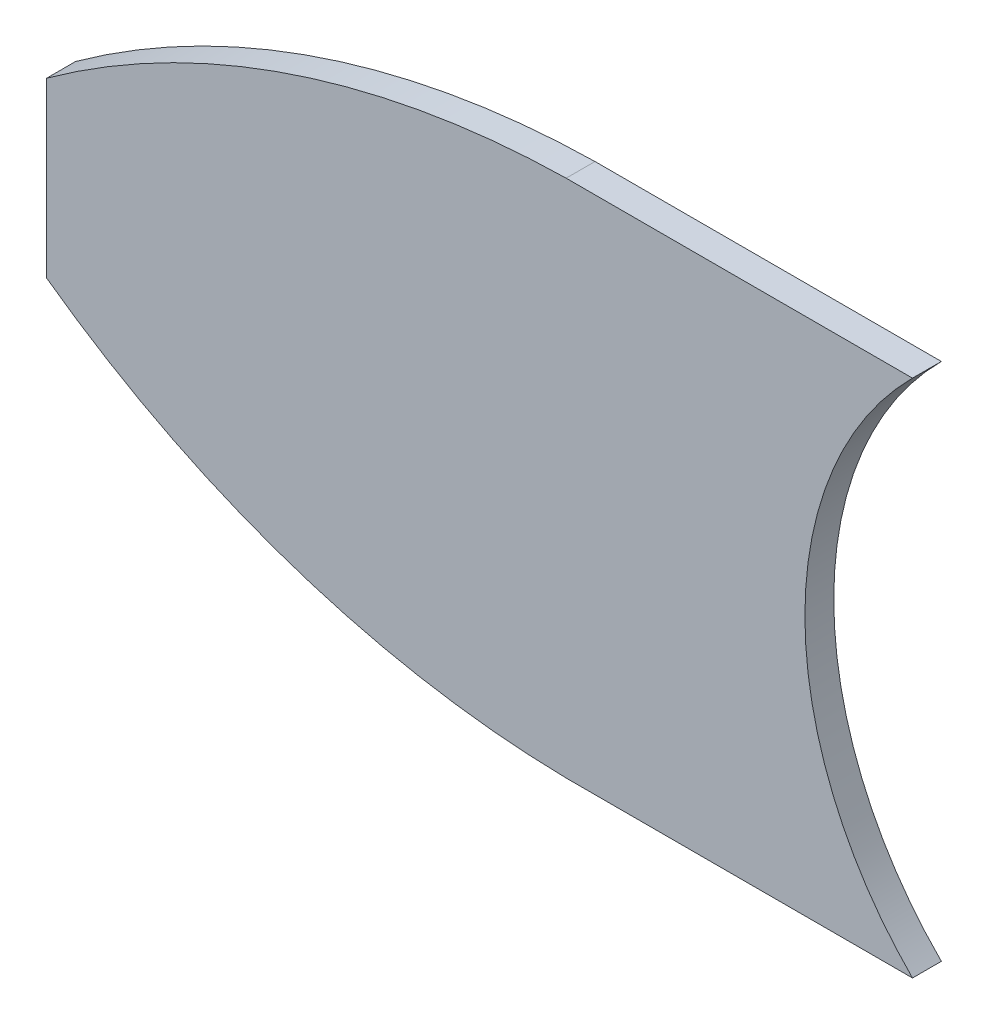
ISO-10303-21;
HEADER;
FILE_DESCRIPTION(('STEP AP214'),'2;1');
FILE_NAME('part.step','',(''),(''),'','','');
FILE_SCHEMA(('AUTOMOTIVE_DESIGN { 1 0 10303 214 1 1 1 1 }'));
ENDSEC;
DATA;
#1=APPLICATION_CONTEXT('core data for automotive mechanical design processes');
#2=APPLICATION_PROTOCOL_DEFINITION('international standard','automotive_design',2000,#1);
#3=PRODUCT_CONTEXT('',#1,'mechanical');
#4=PRODUCT('Part','Part','',(#3));
#5=PRODUCT_RELATED_PRODUCT_CATEGORY('part','',(#4));
#6=PRODUCT_DEFINITION_FORMATION('','',#4);
#7=PRODUCT_DEFINITION_CONTEXT('part definition',#1,'design');
#8=PRODUCT_DEFINITION('design','',#6,#7);
#9=PRODUCT_DEFINITION_SHAPE('','',#8);
#10=(LENGTH_UNIT() NAMED_UNIT(*) SI_UNIT(.MILLI.,.METRE.));
#11=(NAMED_UNIT(*) PLANE_ANGLE_UNIT() SI_UNIT($,.RADIAN.));
#12=(NAMED_UNIT(*) SI_UNIT($,.STERADIAN.) SOLID_ANGLE_UNIT());
#13=UNCERTAINTY_MEASURE_WITH_UNIT(LENGTH_MEASURE(1.E-05),#10,'distance_accuracy_value','');
#14=(GEOMETRIC_REPRESENTATION_CONTEXT(3) GLOBAL_UNCERTAINTY_ASSIGNED_CONTEXT((#13)) GLOBAL_UNIT_ASSIGNED_CONTEXT((#10,
#11,#12)) REPRESENTATION_CONTEXT('',''));
#15=CARTESIAN_POINT('',(0.,0.,0.));
#16=DIRECTION('',(0.,0.,1.));
#17=DIRECTION('',(1.,0.,0.));
#18=AXIS2_PLACEMENT_3D('',#15,#16,#17);
#19=CARTESIAN_POINT('',(90.,90.,10.));
#20=DIRECTION('',(0.,0.,-1.));
#21=DIRECTION('',(-1.,0.,0.));
#22=AXIS2_PLACEMENT_3D('',#19,#20,#21);
#23=CYLINDRICAL_SURFACE('',#22,127.279220613579);
#24=CARTESIAN_POINT('',(90.,90.,0.));
#25=DIRECTION('',(0.,0.,-1.));
#26=DIRECTION('',(1.,0.,0.));
#27=AXIS2_PLACEMENT_3D('',#24,#25,#26);
#28=CIRCLE('',#27,127.279220613579);
#29=CARTESIAN_POINT('',(0.,0.,0.));
#30=VERTEX_POINT('',#29);
#31=CARTESIAN_POINT('',(0.,180.,0.));
#32=VERTEX_POINT('',#31);
#33=EDGE_CURVE('E117',#30,#32,#28,.T.);
#34=ORIENTED_EDGE('',*,*,#33,.T.);
#35=DIRECTION('',(0.,0.,-1.));
#36=VECTOR('',#35,1.);
#37=CARTESIAN_POINT('',(0.,180.,10.));
#38=LINE('',#37,#36);
#39=CARTESIAN_POINT('',(0.,180.,10.));
#40=VERTEX_POINT('',#39);
#41=EDGE_CURVE('E11',#40,#32,#38,.T.);
#42=ORIENTED_EDGE('',*,*,#41,.F.);
#43=CARTESIAN_POINT('',(90.,90.,10.));
#44=DIRECTION('',(0.,0.,-1.));
#45=DIRECTION('',(1.,0.,0.));
#46=AXIS2_PLACEMENT_3D('',#43,#44,#45);
#47=CIRCLE('',#46,127.279220613579);
#48=CARTESIAN_POINT('',(0.,0.,10.));
#49=VERTEX_POINT('',#48);
#50=EDGE_CURVE('E127',#49,#40,#47,.T.);
#51=ORIENTED_EDGE('',*,*,#50,.F.);
#52=DIRECTION('',(0.,0.,-1.));
#53=VECTOR('',#52,1.);
#54=CARTESIAN_POINT('',(0.,0.,10.));
#55=LINE('',#54,#53);
#56=EDGE_CURVE('E113',#49,#30,#55,.T.);
#57=ORIENTED_EDGE('',*,*,#56,.T.);
#58=EDGE_LOOP('',(#34,#42,#51,#57));
#59=FACE_BOUND('',#58,.T.);
#60=ADVANCED_FACE('F33',(#59),#23,.F.);
#61=CARTESIAN_POINT('',(0.,180.,10.));
#62=DIRECTION('',(0.,-1.,0.));
#63=DIRECTION('',(1.,0.,0.));
#64=AXIS2_PLACEMENT_3D('',#61,#62,#63);
#65=PLANE('',#64);
#66=DIRECTION('',(-1.,0.,0.));
#67=VECTOR('',#66,1.);
#68=CARTESIAN_POINT('',(0.,180.,0.));
#69=LINE('',#68,#67);
#70=CARTESIAN_POINT('',(-120.,180.,0.));
#71=VERTEX_POINT('',#70);
#72=EDGE_CURVE('E120',#32,#71,#69,.T.);
#73=ORIENTED_EDGE('',*,*,#72,.T.);
#74=DIRECTION('',(0.,0.,-1.));
#75=VECTOR('',#74,1.);
#76=CARTESIAN_POINT('',(-120.,180.,10.));
#77=LINE('',#76,#75);
#78=CARTESIAN_POINT('',(-120.,180.,10.));
#79=VERTEX_POINT('',#78);
#80=EDGE_CURVE('E41',#79,#71,#77,.T.);
#81=ORIENTED_EDGE('',*,*,#80,.F.);
#82=DIRECTION('',(-1.,0.,0.));
#83=VECTOR('',#82,1.);
#84=CARTESIAN_POINT('',(0.,180.,10.));
#85=LINE('',#84,#83);
#86=EDGE_CURVE('E86',#40,#79,#85,.T.);
#87=ORIENTED_EDGE('',*,*,#86,.F.);
#88=ORIENTED_EDGE('',*,*,#41,.T.);
#89=EDGE_LOOP('',(#73,#81,#87,#88));
#90=FACE_BOUND('',#89,.T.);
#91=ADVANCED_FACE('F151',(#90),#65,.F.);
#92=CARTESIAN_POINT('',(-114.472931586023,-136.58120524193,10.));
#93=DIRECTION('',(0.,0.,-1.));
#94=DIRECTION('',(-1.,0.,0.));
#95=AXIS2_PLACEMENT_3D('',#92,#93,#94);
#96=CYLINDRICAL_SURFACE('',#95,316.629449037335);
#97=CARTESIAN_POINT('',(-114.472931586023,-136.58120524193,0.));
#98=DIRECTION('',(0.,0.,1.));
#99=DIRECTION('',(-1.,0.,0.));
#100=AXIS2_PLACEMENT_3D('',#97,#98,#99);
#101=CIRCLE('',#100,316.629449037335);
#102=CARTESIAN_POINT('',(-300.,120.,0.));
#103=VERTEX_POINT('',#102);
#104=EDGE_CURVE('E122',#71,#103,#101,.T.);
#105=ORIENTED_EDGE('',*,*,#104,.T.);
#106=DIRECTION('',(0.,0.,-1.));
#107=VECTOR('',#106,1.);
#108=CARTESIAN_POINT('',(-300.,120.,10.));
#109=LINE('',#108,#107);
#110=CARTESIAN_POINT('',(-300.,120.,10.));
#111=VERTEX_POINT('',#110);
#112=EDGE_CURVE('E108',#111,#103,#109,.T.);
#113=ORIENTED_EDGE('',*,*,#112,.F.);
#114=CARTESIAN_POINT('',(-114.472931586023,-136.58120524193,10.));
#115=DIRECTION('',(0.,0.,1.));
#116=DIRECTION('',(-1.,0.,0.));
#117=AXIS2_PLACEMENT_3D('',#114,#115,#116);
#118=CIRCLE('',#117,316.629449037335);
#119=EDGE_CURVE('E99',#79,#111,#118,.T.);
#120=ORIENTED_EDGE('',*,*,#119,.F.);
#121=ORIENTED_EDGE('',*,*,#80,.T.);
#122=EDGE_LOOP('',(#105,#113,#120,#121));
#123=FACE_BOUND('',#122,.T.);
#124=ADVANCED_FACE('F133',(#123),#96,.T.);
#125=CARTESIAN_POINT('',(-300.,60.0000000000004,10.));
#126=DIRECTION('',(1.,0.,0.));
#127=DIRECTION('',(0.,0.,-1.));
#128=AXIS2_PLACEMENT_3D('',#125,#126,#127);
#129=PLANE('',#128);
#130=DIRECTION('',(0.,-1.,0.));
#131=VECTOR('',#130,1.);
#132=CARTESIAN_POINT('',(-300.,60.0000000000004,0.));
#133=LINE('',#132,#131);
#134=CARTESIAN_POINT('',(-300.,60.0000000000004,0.));
#135=VERTEX_POINT('',#134);
#136=EDGE_CURVE('E107',#103,#135,#133,.T.);
#137=ORIENTED_EDGE('',*,*,#136,.T.);
#138=DIRECTION('',(0.,0.,-1.));
#139=VECTOR('',#138,1.);
#140=CARTESIAN_POINT('',(-300.,60.0000000000004,10.));
#141=LINE('',#140,#139);
#142=CARTESIAN_POINT('',(-300.,60.0000000000004,10.));
#143=VERTEX_POINT('',#142);
#144=EDGE_CURVE('E104',#143,#135,#141,.T.);
#145=ORIENTED_EDGE('',*,*,#144,.F.);
#146=DIRECTION('',(0.,-1.,0.));
#147=VECTOR('',#146,1.);
#148=CARTESIAN_POINT('',(-300.,60.0000000000004,10.));
#149=LINE('',#148,#147);
#150=EDGE_CURVE('E93',#111,#143,#149,.T.);
#151=ORIENTED_EDGE('',*,*,#150,.F.);
#152=ORIENTED_EDGE('',*,*,#112,.T.);
#153=EDGE_LOOP('',(#137,#145,#151,#152));
#154=FACE_BOUND('',#153,.T.);
#155=ADVANCED_FACE('F105',(#154),#129,.F.);
#156=CARTESIAN_POINT('',(-114.472931586023,316.58120524193,10.));
#157=DIRECTION('',(0.,0.,-1.));
#158=DIRECTION('',(-1.,0.,0.));
#159=AXIS2_PLACEMENT_3D('',#156,#157,#158);
#160=CYLINDRICAL_SURFACE('',#159,316.629449037335);
#161=CARTESIAN_POINT('',(-114.472931586023,316.58120524193,0.));
#162=DIRECTION('',(0.,0.,1.));
#163=DIRECTION('',(1.,0.,0.));
#164=AXIS2_PLACEMENT_3D('',#161,#162,#163);
#165=CIRCLE('',#164,316.629449037335);
#166=CARTESIAN_POINT('',(-120.,0.,0.));
#167=VERTEX_POINT('',#166);
#168=EDGE_CURVE('E72',#135,#167,#165,.T.);
#169=ORIENTED_EDGE('',*,*,#168,.T.);
#170=DIRECTION('',(0.,0.,-1.));
#171=VECTOR('',#170,1.);
#172=CARTESIAN_POINT('',(-120.,0.,10.));
#173=LINE('',#172,#171);
#174=CARTESIAN_POINT('',(-120.,0.,10.));
#175=VERTEX_POINT('',#174);
#176=EDGE_CURVE('E109',#175,#167,#173,.T.);
#177=ORIENTED_EDGE('',*,*,#176,.F.);
#178=CARTESIAN_POINT('',(-114.472931586023,316.58120524193,10.));
#179=DIRECTION('',(0.,0.,1.));
#180=DIRECTION('',(1.,0.,0.));
#181=AXIS2_PLACEMENT_3D('',#178,#179,#180);
#182=CIRCLE('',#181,316.629449037335);
#183=EDGE_CURVE('E97',#143,#175,#182,.T.);
#184=ORIENTED_EDGE('',*,*,#183,.F.);
#185=ORIENTED_EDGE('',*,*,#144,.T.);
#186=EDGE_LOOP('',(#169,#177,#184,#185));
#187=FACE_BOUND('',#186,.T.);
#188=ADVANCED_FACE('F111',(#187),#160,.T.);
#189=CARTESIAN_POINT('',(0.,0.,10.));
#190=DIRECTION('',(0.,1.,0.));
#191=DIRECTION('',(-1.,0.,0.));
#192=AXIS2_PLACEMENT_3D('',#189,#190,#191);
#193=PLANE('',#192);
#194=DIRECTION('',(1.,0.,0.));
#195=VECTOR('',#194,1.);
#196=CARTESIAN_POINT('',(0.,0.,0.));
#197=LINE('',#196,#195);
#198=EDGE_CURVE('E78',#167,#30,#197,.T.);
#199=ORIENTED_EDGE('',*,*,#198,.T.);
#200=ORIENTED_EDGE('',*,*,#56,.F.);
#201=DIRECTION('',(1.,0.,0.));
#202=VECTOR('',#201,1.);
#203=CARTESIAN_POINT('',(0.,0.,10.));
#204=LINE('',#203,#202);
#205=EDGE_CURVE('E49',#175,#49,#204,.T.);
#206=ORIENTED_EDGE('',*,*,#205,.F.);
#207=ORIENTED_EDGE('',*,*,#176,.T.);
#208=EDGE_LOOP('',(#199,#200,#206,#207));
#209=FACE_BOUND('',#208,.T.);
#210=ADVANCED_FACE('F140',(#209),#193,.F.);
#211=CARTESIAN_POINT('',(90.,90.,10.));
#212=DIRECTION('',(0.,0.,1.));
#213=DIRECTION('',(1.,0.,0.));
#214=AXIS2_PLACEMENT_3D('',#211,#212,#213);
#215=PLANE('',#214);
#216=ORIENTED_EDGE('',*,*,#50,.T.);
#217=ORIENTED_EDGE('',*,*,#86,.T.);
#218=ORIENTED_EDGE('',*,*,#119,.T.);
#219=ORIENTED_EDGE('',*,*,#150,.T.);
#220=ORIENTED_EDGE('',*,*,#183,.T.);
#221=ORIENTED_EDGE('',*,*,#205,.T.);
#222=EDGE_LOOP('',(#216,#217,#218,#219,#220,#221));
#223=FACE_BOUND('',#222,.T.);
#224=ADVANCED_FACE('F95',(#223),#215,.T.);
#225=CARTESIAN_POINT('',(90.,90.,0.));
#226=DIRECTION('',(0.,0.,1.));
#227=DIRECTION('',(1.,0.,0.));
#228=AXIS2_PLACEMENT_3D('',#225,#226,#227);
#229=PLANE('',#228);
#230=ORIENTED_EDGE('',*,*,#33,.F.);
#231=ORIENTED_EDGE('',*,*,#198,.F.);
#232=ORIENTED_EDGE('',*,*,#168,.F.);
#233=ORIENTED_EDGE('',*,*,#136,.F.);
#234=ORIENTED_EDGE('',*,*,#104,.F.);
#235=ORIENTED_EDGE('',*,*,#72,.F.);
#236=EDGE_LOOP('',(#230,#231,#232,#233,#234,#235));
#237=FACE_BOUND('',#236,.T.);
#238=ADVANCED_FACE('F136',(#237),#229,.F.);
#239=CLOSED_SHELL('',(#60,#91,#124,#155,#188,#210,#224,#238));
#240=MANIFOLD_SOLID_BREP('B2',#239);
#241=ADVANCED_BREP_SHAPE_REPRESENTATION('',(#18,#240),#14);
#242=SHAPE_DEFINITION_REPRESENTATION(#9,#241);
ENDSEC;
END-ISO-10303-21;
